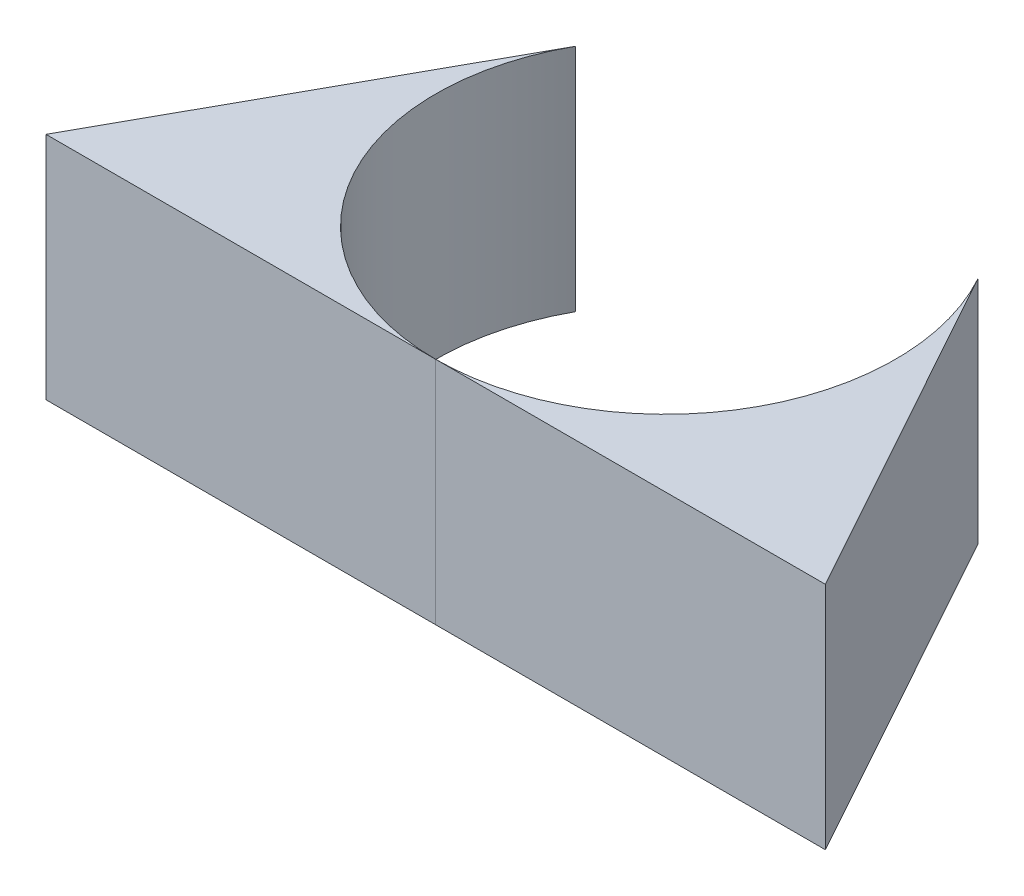
ISO-10303-21;
HEADER;
FILE_DESCRIPTION(('STEP AP214'),'2;1');
FILE_NAME('part.step','',(''),(''),'','','');
FILE_SCHEMA(('AUTOMOTIVE_DESIGN { 1 0 10303 214 1 1 1 1 }'));
ENDSEC;
DATA;
#1=APPLICATION_CONTEXT('core data for automotive mechanical design processes');
#2=APPLICATION_PROTOCOL_DEFINITION('international standard','automotive_design',2000,#1);
#3=PRODUCT_CONTEXT('',#1,'mechanical');
#4=PRODUCT('Part','Part','',(#3));
#5=PRODUCT_RELATED_PRODUCT_CATEGORY('part','',(#4));
#6=PRODUCT_DEFINITION_FORMATION('','',#4);
#7=PRODUCT_DEFINITION_CONTEXT('part definition',#1,'design');
#8=PRODUCT_DEFINITION('design','',#6,#7);
#9=PRODUCT_DEFINITION_SHAPE('','',#8);
#10=(LENGTH_UNIT() NAMED_UNIT(*) SI_UNIT(.MILLI.,.METRE.));
#11=(NAMED_UNIT(*) PLANE_ANGLE_UNIT() SI_UNIT($,.RADIAN.));
#12=(NAMED_UNIT(*) SI_UNIT($,.STERADIAN.) SOLID_ANGLE_UNIT());
#13=UNCERTAINTY_MEASURE_WITH_UNIT(LENGTH_MEASURE(1.E-05),#10,'distance_accuracy_value','');
#14=(GEOMETRIC_REPRESENTATION_CONTEXT(3) GLOBAL_UNCERTAINTY_ASSIGNED_CONTEXT((#13)) GLOBAL_UNIT_ASSIGNED_CONTEXT((#10,
#11,#12)) REPRESENTATION_CONTEXT('',''));
#15=CARTESIAN_POINT('',(0.,0.,0.));
#16=DIRECTION('',(0.,0.,1.));
#17=DIRECTION('',(1.,0.,0.));
#18=AXIS2_PLACEMENT_3D('',#15,#16,#17);
#19=CARTESIAN_POINT('',(-5.3819366033462,3.175,-3.175));
#20=DIRECTION('',(0.,-1.,0.));
#21=DIRECTION('',(0.,0.,-1.));
#22=AXIS2_PLACEMENT_3D('',#19,#20,#21);
#23=CYLINDRICAL_SURFACE('',#22,3.175);
#24=CARTESIAN_POINT('',(-5.3819366033462,0.,-3.175));
#25=DIRECTION('',(0.,1.,0.));
#26=DIRECTION('',(0.,0.,1.));
#27=AXIS2_PLACEMENT_3D('',#24,#25,#26);
#28=CIRCLE('',#27,3.175);
#29=CARTESIAN_POINT('',(-5.3819366033462,0.,0.));
#30=VERTEX_POINT('',#29);
#31=CARTESIAN_POINT('',(-2.602985108966,0.,-4.7105955170168));
#32=VERTEX_POINT('',#31);
#33=EDGE_CURVE('E112',#30,#32,#28,.T.);
#34=ORIENTED_EDGE('',*,*,#33,.F.);
#35=DIRECTION('',(0.,-1.,0.));
#36=VECTOR('',#35,1.);
#37=CARTESIAN_POINT('',(-5.3819366033462,3.175,0.));
#38=LINE('',#37,#36);
#39=CARTESIAN_POINT('',(-5.3819366033462,3.175,0.));
#40=VERTEX_POINT('',#39);
#41=EDGE_CURVE('E13',#40,#30,#38,.T.);
#42=ORIENTED_EDGE('',*,*,#41,.F.);
#43=CARTESIAN_POINT('',(-5.3819366033462,3.175,-3.175));
#44=DIRECTION('',(0.,1.,0.));
#45=DIRECTION('',(0.,0.,1.));
#46=AXIS2_PLACEMENT_3D('',#43,#44,#45);
#47=CIRCLE('',#46,3.175);
#48=CARTESIAN_POINT('',(-2.602985108966,3.175,-4.7105955170168));
#49=VERTEX_POINT('',#48);
#50=EDGE_CURVE('E110',#40,#49,#47,.T.);
#51=ORIENTED_EDGE('',*,*,#50,.T.);
#52=DIRECTION('',(0.,-1.,0.));
#53=VECTOR('',#52,1.);
#54=CARTESIAN_POINT('',(-2.602985108966,3.175,-4.7105955170168));
#55=LINE('',#54,#53);
#56=EDGE_CURVE('E90',#49,#32,#55,.T.);
#57=ORIENTED_EDGE('',*,*,#56,.T.);
#58=EDGE_LOOP('',(#34,#42,#51,#57));
#59=FACE_BOUND('',#58,.T.);
#60=ADVANCED_FACE('F71',(#59),#23,.F.);
#61=CARTESIAN_POINT('',(0.,3.175,0.));
#62=DIRECTION('',(0.,0.,1.));
#63=DIRECTION('',(1.,0.,0.));
#64=AXIS2_PLACEMENT_3D('',#61,#62,#63);
#65=PLANE('',#64);
#66=DIRECTION('',(-1.,0.,0.));
#67=VECTOR('',#66,1.);
#68=CARTESIAN_POINT('',(0.,0.,0.));
#69=LINE('',#68,#67);
#70=CARTESIAN_POINT('',(0.,0.,0.));
#71=VERTEX_POINT('',#70);
#72=EDGE_CURVE('E133',#71,#30,#69,.T.);
#73=ORIENTED_EDGE('',*,*,#72,.F.);
#74=DIRECTION('',(0.,-1.,0.));
#75=VECTOR('',#74,1.);
#76=CARTESIAN_POINT('',(0.,3.175,0.));
#77=LINE('',#76,#75);
#78=CARTESIAN_POINT('',(0.,3.175,0.));
#79=VERTEX_POINT('',#78);
#80=EDGE_CURVE('E80',#79,#71,#77,.T.);
#81=ORIENTED_EDGE('',*,*,#80,.F.);
#82=DIRECTION('',(-1.,0.,0.));
#83=VECTOR('',#82,1.);
#84=CARTESIAN_POINT('',(0.,3.175,0.));
#85=LINE('',#84,#83);
#86=EDGE_CURVE('E119',#79,#40,#85,.T.);
#87=ORIENTED_EDGE('',*,*,#86,.T.);
#88=ORIENTED_EDGE('',*,*,#41,.T.);
#89=EDGE_LOOP('',(#73,#81,#87,#88));
#90=FACE_BOUND('',#89,.T.);
#91=ADVANCED_FACE('F124',(#90),#65,.T.);
#92=CARTESIAN_POINT('',(0.,3.175,0.));
#93=DIRECTION('',(0.875260313190611,0.,-0.483652131343875));
#94=DIRECTION('',(-0.483652131343876,0.,-0.875260313190611));
#95=AXIS2_PLACEMENT_3D('',#92,#93,#94);
#96=PLANE('',#95);
#97=DIRECTION('',(0.483652131343876,0.,0.875260313190611));
#98=VECTOR('',#97,1.);
#99=CARTESIAN_POINT('',(0.,0.,0.));
#100=LINE('',#99,#98);
#101=EDGE_CURVE('E122',#32,#71,#100,.T.);
#102=ORIENTED_EDGE('',*,*,#101,.F.);
#103=ORIENTED_EDGE('',*,*,#56,.F.);
#104=DIRECTION('',(0.483652131343876,0.,0.875260313190611));
#105=VECTOR('',#104,1.);
#106=CARTESIAN_POINT('',(0.,3.175,0.));
#107=LINE('',#106,#105);
#108=EDGE_CURVE('E120',#49,#79,#107,.T.);
#109=ORIENTED_EDGE('',*,*,#108,.T.);
#110=ORIENTED_EDGE('',*,*,#80,.T.);
#111=EDGE_LOOP('',(#102,#103,#109,#110));
#112=FACE_BOUND('',#111,.T.);
#113=ADVANCED_FACE('F142',(#112),#96,.T.);
#114=CARTESIAN_POINT('',(0.,3.175,0.));
#115=DIRECTION('',(0.,1.,0.));
#116=DIRECTION('',(0.,0.,1.));
#117=AXIS2_PLACEMENT_3D('',#114,#115,#116);
#118=PLANE('',#117);
#119=ORIENTED_EDGE('',*,*,#50,.F.);
#120=ORIENTED_EDGE('',*,*,#86,.F.);
#121=ORIENTED_EDGE('',*,*,#108,.F.);
#122=EDGE_LOOP('',(#119,#120,#121));
#123=FACE_BOUND('',#122,.T.);
#124=ADVANCED_FACE('F118',(#123),#118,.T.);
#125=CARTESIAN_POINT('',(0.,0.,0.));
#126=DIRECTION('',(0.,1.,0.));
#127=DIRECTION('',(0.,0.,1.));
#128=AXIS2_PLACEMENT_3D('',#125,#126,#127);
#129=PLANE('',#128);
#130=ORIENTED_EDGE('',*,*,#33,.T.);
#131=ORIENTED_EDGE('',*,*,#101,.T.);
#132=ORIENTED_EDGE('',*,*,#72,.T.);
#133=EDGE_LOOP('',(#130,#131,#132));
#134=FACE_BOUND('',#133,.T.);
#135=ADVANCED_FACE('F141',(#134),#129,.F.);
#136=CLOSED_SHELL('',(#60,#91,#113,#124,#135));
#137=MANIFOLD_SOLID_BREP('B2',#136);
#138=CARTESIAN_POINT('',(-5.3819366033462,3.175,-3.175));
#139=DIRECTION('',(0.,-1.,0.));
#140=DIRECTION('',(0.,0.,-1.));
#141=AXIS2_PLACEMENT_3D('',#138,#139,#140);
#142=CYLINDRICAL_SURFACE('',#141,3.175);
#143=CARTESIAN_POINT('',(-5.3819366033462,0.,-3.175));
#144=DIRECTION('',(0.,1.,0.));
#145=DIRECTION('',(0.,0.,1.));
#146=AXIS2_PLACEMENT_3D('',#143,#144,#145);
#147=CIRCLE('',#146,3.175);
#148=CARTESIAN_POINT('',(-8.16088809772639,0.,-4.7105955170168));
#149=VERTEX_POINT('',#148);
#150=CARTESIAN_POINT('',(-5.3819366033462,0.,0.));
#151=VERTEX_POINT('',#150);
#152=EDGE_CURVE('E228',#149,#151,#147,.T.);
#153=ORIENTED_EDGE('',*,*,#152,.F.);
#154=DIRECTION('',(0.,-1.,0.));
#155=VECTOR('',#154,1.);
#156=CARTESIAN_POINT('',(-8.16088809772639,3.175,-4.7105955170168));
#157=LINE('',#156,#155);
#158=CARTESIAN_POINT('',(-8.16088809772639,3.175,-4.7105955170168));
#159=VERTEX_POINT('',#158);
#160=EDGE_CURVE('E69',#159,#149,#157,.T.);
#161=ORIENTED_EDGE('',*,*,#160,.F.);
#162=CARTESIAN_POINT('',(-5.3819366033462,3.175,-3.175));
#163=DIRECTION('',(0.,1.,0.));
#164=DIRECTION('',(0.,0.,1.));
#165=AXIS2_PLACEMENT_3D('',#162,#163,#164);
#166=CIRCLE('',#165,3.175);
#167=CARTESIAN_POINT('',(-5.3819366033462,3.175,0.));
#168=VERTEX_POINT('',#167);
#169=EDGE_CURVE('E226',#159,#168,#166,.T.);
#170=ORIENTED_EDGE('',*,*,#169,.T.);
#171=DIRECTION('',(0.,-1.,0.));
#172=VECTOR('',#171,1.);
#173=CARTESIAN_POINT('',(-5.3819366033462,3.175,0.));
#174=LINE('',#173,#172);
#175=EDGE_CURVE('E207',#168,#151,#174,.T.);
#176=ORIENTED_EDGE('',*,*,#175,.T.);
#177=EDGE_LOOP('',(#153,#161,#170,#176));
#178=FACE_BOUND('',#177,.T.);
#179=ADVANCED_FACE('F187',(#178),#142,.F.);
#180=CARTESIAN_POINT('',(-8.24599461507683,3.175,-4.55657912340817));
#181=DIRECTION('',(-0.875260313190611,0.,-0.483652131343876));
#182=DIRECTION('',(-0.483652131343876,0.,0.875260313190611));
#183=AXIS2_PLACEMENT_3D('',#180,#181,#182);
#184=PLANE('',#183);
#185=DIRECTION('',(0.483652131343876,0.,-0.875260313190611));
#186=VECTOR('',#185,1.);
#187=CARTESIAN_POINT('',(-8.24599461507683,0.,-4.55657912340817));
#188=LINE('',#187,#186);
#189=CARTESIAN_POINT('',(-10.7638732066924,0.,0.));
#190=VERTEX_POINT('',#189);
#191=EDGE_CURVE('E248',#190,#149,#188,.T.);
#192=ORIENTED_EDGE('',*,*,#191,.F.);
#193=DIRECTION('',(0.,-1.,0.));
#194=VECTOR('',#193,1.);
#195=CARTESIAN_POINT('',(-10.7638732066924,3.175,0.));
#196=LINE('',#195,#194);
#197=CARTESIAN_POINT('',(-10.7638732066924,3.175,0.));
#198=VERTEX_POINT('',#197);
#199=EDGE_CURVE('E196',#198,#190,#196,.T.);
#200=ORIENTED_EDGE('',*,*,#199,.F.);
#201=DIRECTION('',(0.483652131343876,0.,-0.875260313190611));
#202=VECTOR('',#201,1.);
#203=CARTESIAN_POINT('',(-8.24599461507683,3.175,-4.55657912340817));
#204=LINE('',#203,#202);
#205=EDGE_CURVE('E235',#198,#159,#204,.T.);
#206=ORIENTED_EDGE('',*,*,#205,.T.);
#207=ORIENTED_EDGE('',*,*,#160,.T.);
#208=EDGE_LOOP('',(#192,#200,#206,#207));
#209=FACE_BOUND('',#208,.T.);
#210=ADVANCED_FACE('F240',(#209),#184,.T.);
#211=CARTESIAN_POINT('',(0.,3.175,0.));
#212=DIRECTION('',(0.,0.,1.));
#213=DIRECTION('',(1.,0.,0.));
#214=AXIS2_PLACEMENT_3D('',#211,#212,#213);
#215=PLANE('',#214);
#216=DIRECTION('',(-1.,0.,0.));
#217=VECTOR('',#216,1.);
#218=CARTESIAN_POINT('',(0.,0.,0.));
#219=LINE('',#218,#217);
#220=EDGE_CURVE('E238',#151,#190,#219,.T.);
#221=ORIENTED_EDGE('',*,*,#220,.F.);
#222=ORIENTED_EDGE('',*,*,#175,.F.);
#223=DIRECTION('',(-1.,0.,0.));
#224=VECTOR('',#223,1.);
#225=CARTESIAN_POINT('',(0.,3.175,0.));
#226=LINE('',#225,#224);
#227=EDGE_CURVE('E236',#168,#198,#226,.T.);
#228=ORIENTED_EDGE('',*,*,#227,.T.);
#229=ORIENTED_EDGE('',*,*,#199,.T.);
#230=EDGE_LOOP('',(#221,#222,#228,#229));
#231=FACE_BOUND('',#230,.T.);
#232=ADVANCED_FACE('F258',(#231),#215,.T.);
#233=CARTESIAN_POINT('',(0.,3.175,0.));
#234=DIRECTION('',(0.,1.,0.));
#235=DIRECTION('',(0.,0.,1.));
#236=AXIS2_PLACEMENT_3D('',#233,#234,#235);
#237=PLANE('',#236);
#238=ORIENTED_EDGE('',*,*,#169,.F.);
#239=ORIENTED_EDGE('',*,*,#205,.F.);
#240=ORIENTED_EDGE('',*,*,#227,.F.);
#241=EDGE_LOOP('',(#238,#239,#240));
#242=FACE_BOUND('',#241,.T.);
#243=ADVANCED_FACE('F234',(#242),#237,.T.);
#244=CARTESIAN_POINT('',(0.,0.,0.));
#245=DIRECTION('',(0.,1.,0.));
#246=DIRECTION('',(0.,0.,1.));
#247=AXIS2_PLACEMENT_3D('',#244,#245,#246);
#248=PLANE('',#247);
#249=ORIENTED_EDGE('',*,*,#152,.T.);
#250=ORIENTED_EDGE('',*,*,#220,.T.);
#251=ORIENTED_EDGE('',*,*,#191,.T.);
#252=EDGE_LOOP('',(#249,#250,#251));
#253=FACE_BOUND('',#252,.T.);
#254=ADVANCED_FACE('F257',(#253),#248,.F.);
#255=CLOSED_SHELL('',(#179,#210,#232,#243,#254));
#256=MANIFOLD_SOLID_BREP('B7',#255);
#257=ADVANCED_BREP_SHAPE_REPRESENTATION('',(#18,#137,#256),#14);
#258=SHAPE_DEFINITION_REPRESENTATION(#9,#257);
ENDSEC;
END-ISO-10303-21;
